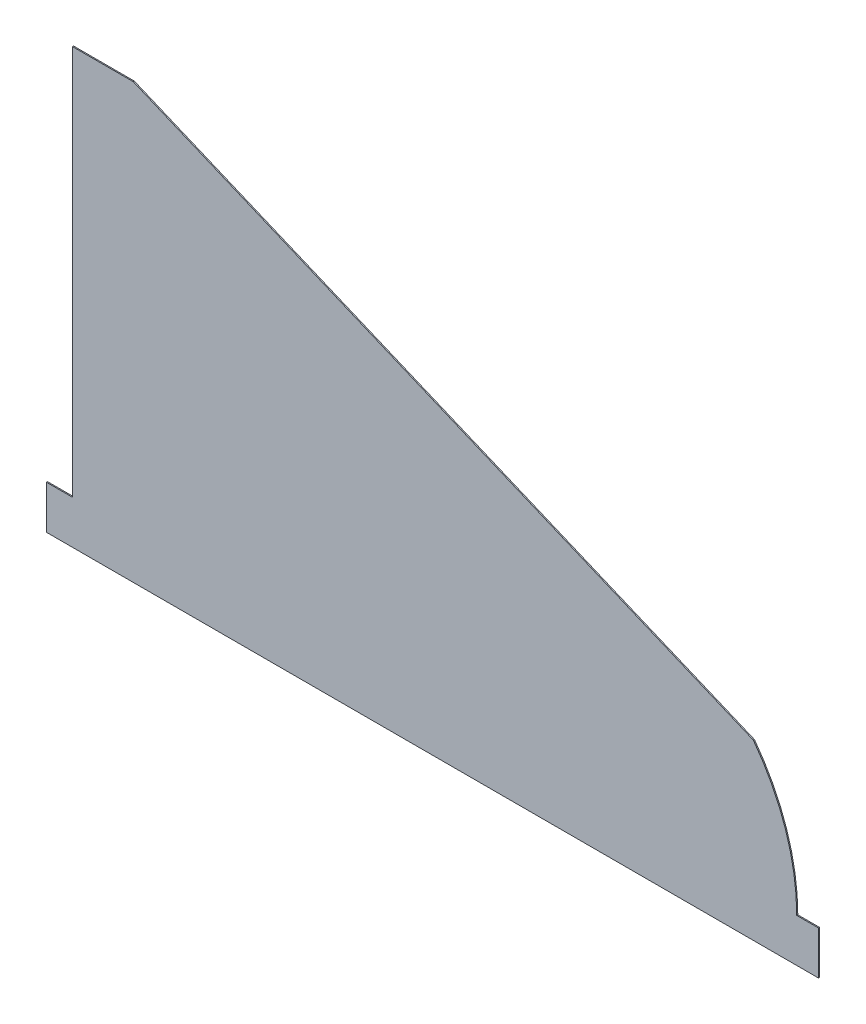
ISO-10303-21;
HEADER;
FILE_DESCRIPTION(('STEP AP214'),'2;1');
FILE_NAME('part.step','',(''),(''),'','','');
FILE_SCHEMA(('AUTOMOTIVE_DESIGN { 1 0 10303 214 1 1 1 1 }'));
ENDSEC;
DATA;
#1=APPLICATION_CONTEXT('core data for automotive mechanical design processes');
#2=APPLICATION_PROTOCOL_DEFINITION('international standard','automotive_design',2000,#1);
#3=PRODUCT_CONTEXT('',#1,'mechanical');
#4=PRODUCT('Part','Part','',(#3));
#5=PRODUCT_RELATED_PRODUCT_CATEGORY('part','',(#4));
#6=PRODUCT_DEFINITION_FORMATION('','',#4);
#7=PRODUCT_DEFINITION_CONTEXT('part definition',#1,'design');
#8=PRODUCT_DEFINITION('design','',#6,#7);
#9=PRODUCT_DEFINITION_SHAPE('','',#8);
#10=(LENGTH_UNIT() NAMED_UNIT(*) SI_UNIT(.MILLI.,.METRE.));
#11=(NAMED_UNIT(*) PLANE_ANGLE_UNIT() SI_UNIT($,.RADIAN.));
#12=(NAMED_UNIT(*) SI_UNIT($,.STERADIAN.) SOLID_ANGLE_UNIT());
#13=UNCERTAINTY_MEASURE_WITH_UNIT(LENGTH_MEASURE(1.E-05),#10,'distance_accuracy_value','');
#14=(GEOMETRIC_REPRESENTATION_CONTEXT(3) GLOBAL_UNCERTAINTY_ASSIGNED_CONTEXT((#13)) GLOBAL_UNIT_ASSIGNED_CONTEXT((#10,
#11,#12)) REPRESENTATION_CONTEXT('',''));
#15=CARTESIAN_POINT('',(0.,0.,0.));
#16=DIRECTION('',(0.,0.,1.));
#17=DIRECTION('',(1.,0.,0.));
#18=AXIS2_PLACEMENT_3D('',#15,#16,#17);
#19=CARTESIAN_POINT('',(168.,0.,0.125));
#20=DIRECTION('',(0.,1.,0.));
#21=DIRECTION('',(0.,0.,1.));
#22=AXIS2_PLACEMENT_3D('',#19,#20,#21);
#23=PLANE('',#22);
#24=DIRECTION('',(1.,0.,0.));
#25=VECTOR('',#24,1.);
#26=CARTESIAN_POINT('',(168.,0.,-0.125));
#27=LINE('',#26,#25);
#28=CARTESIAN_POINT('',(-5.,0.,-0.125));
#29=VERTEX_POINT('',#28);
#30=CARTESIAN_POINT('',(173.,0.,-0.125));
#31=VERTEX_POINT('',#30);
#32=EDGE_CURVE('E82',#29,#31,#27,.T.);
#33=ORIENTED_EDGE('',*,*,#32,.T.);
#34=DIRECTION('',(0.,0.,-1.));
#35=VECTOR('',#34,1.);
#36=CARTESIAN_POINT('',(173.,0.,0.125));
#37=LINE('',#36,#35);
#38=CARTESIAN_POINT('',(173.,0.,0.125));
#39=VERTEX_POINT('',#38);
#40=EDGE_CURVE('E11',#39,#31,#37,.T.);
#41=ORIENTED_EDGE('',*,*,#40,.F.);
#42=DIRECTION('',(1.,0.,0.));
#43=VECTOR('',#42,1.);
#44=CARTESIAN_POINT('',(-5.,0.,0.125));
#45=LINE('',#44,#43);
#46=CARTESIAN_POINT('',(-5.,0.,0.125));
#47=VERTEX_POINT('',#46);
#48=EDGE_CURVE('E88',#47,#39,#45,.T.);
#49=ORIENTED_EDGE('',*,*,#48,.F.);
#50=DIRECTION('',(0.,0.,-1.));
#51=VECTOR('',#50,1.);
#52=CARTESIAN_POINT('',(-5.,0.,0.125));
#53=LINE('',#52,#51);
#54=EDGE_CURVE('E136',#47,#29,#53,.T.);
#55=ORIENTED_EDGE('',*,*,#54,.T.);
#56=EDGE_LOOP('',(#33,#41,#49,#55));
#57=FACE_BOUND('',#56,.T.);
#58=ADVANCED_FACE('F32',(#57),#23,.F.);
#59=CARTESIAN_POINT('',(173.,0.,0.125));
#60=DIRECTION('',(-1.,0.,0.));
#61=DIRECTION('',(0.,0.,1.));
#62=AXIS2_PLACEMENT_3D('',#59,#60,#61);
#63=PLANE('',#62);
#64=DIRECTION('',(0.,1.,0.));
#65=VECTOR('',#64,1.);
#66=CARTESIAN_POINT('',(173.,0.,-0.125));
#67=LINE('',#66,#65);
#68=CARTESIAN_POINT('',(173.,10.,-0.125));
#69=VERTEX_POINT('',#68);
#70=EDGE_CURVE('E138',#31,#69,#67,.T.);
#71=ORIENTED_EDGE('',*,*,#70,.T.);
#72=DIRECTION('',(0.,0.,-1.));
#73=VECTOR('',#72,1.);
#74=CARTESIAN_POINT('',(173.,10.,0.125));
#75=LINE('',#74,#73);
#76=CARTESIAN_POINT('',(173.,10.,0.125));
#77=VERTEX_POINT('',#76);
#78=EDGE_CURVE('E39',#77,#69,#75,.T.);
#79=ORIENTED_EDGE('',*,*,#78,.F.);
#80=DIRECTION('',(0.,1.,0.));
#81=VECTOR('',#80,1.);
#82=CARTESIAN_POINT('',(173.,0.,0.125));
#83=LINE('',#82,#81);
#84=EDGE_CURVE('E171',#39,#77,#83,.T.);
#85=ORIENTED_EDGE('',*,*,#84,.F.);
#86=ORIENTED_EDGE('',*,*,#40,.T.);
#87=EDGE_LOOP('',(#71,#79,#85,#86));
#88=FACE_BOUND('',#87,.T.);
#89=ADVANCED_FACE('F196',(#88),#63,.F.);
#90=CARTESIAN_POINT('',(173.,10.,0.125));
#91=DIRECTION('',(0.,-1.,0.));
#92=DIRECTION('',(0.,0.,-1.));
#93=AXIS2_PLACEMENT_3D('',#90,#91,#92);
#94=PLANE('',#93);
#95=DIRECTION('',(-1.,0.,0.));
#96=VECTOR('',#95,1.);
#97=CARTESIAN_POINT('',(173.,10.,-0.125));
#98=LINE('',#97,#96);
#99=CARTESIAN_POINT('',(168.,10.,-0.125));
#100=VERTEX_POINT('',#99);
#101=EDGE_CURVE('E140',#69,#100,#98,.T.);
#102=ORIENTED_EDGE('',*,*,#101,.T.);
#103=DIRECTION('',(0.,0.,-1.));
#104=VECTOR('',#103,1.);
#105=CARTESIAN_POINT('',(168.,10.,0.125));
#106=LINE('',#105,#104);
#107=CARTESIAN_POINT('',(168.,10.,0.125));
#108=VERTEX_POINT('',#107);
#109=EDGE_CURVE('E155',#108,#100,#106,.T.);
#110=ORIENTED_EDGE('',*,*,#109,.F.);
#111=DIRECTION('',(-1.,0.,0.));
#112=VECTOR('',#111,1.);
#113=CARTESIAN_POINT('',(173.,10.,0.125));
#114=LINE('',#113,#112);
#115=EDGE_CURVE('E164',#77,#108,#114,.T.);
#116=ORIENTED_EDGE('',*,*,#115,.F.);
#117=ORIENTED_EDGE('',*,*,#78,.T.);
#118=EDGE_LOOP('',(#102,#110,#116,#117));
#119=FACE_BOUND('',#118,.T.);
#120=ADVANCED_FACE('F162',(#119),#94,.F.);
#121=CARTESIAN_POINT('',(118.,9.99999999999999,0.125));
#122=DIRECTION('',(0.,0.,-1.));
#123=DIRECTION('',(-1.,0.,0.));
#124=AXIS2_PLACEMENT_3D('',#121,#122,#123);
#125=CYLINDRICAL_SURFACE('',#124,50.);
#126=CARTESIAN_POINT('',(118.,9.99999999999999,-0.125));
#127=DIRECTION('',(0.,0.,1.));
#128=DIRECTION('',(1.,0.,0.));
#129=AXIS2_PLACEMENT_3D('',#126,#127,#128);
#130=CIRCLE('',#129,50.);
#131=CARTESIAN_POINT('',(158.,40.,-0.125));
#132=VERTEX_POINT('',#131);
#133=EDGE_CURVE('E142',#100,#132,#130,.T.);
#134=ORIENTED_EDGE('',*,*,#133,.T.);
#135=DIRECTION('',(0.,0.,-1.));
#136=VECTOR('',#135,1.);
#137=CARTESIAN_POINT('',(158.,40.,0.125));
#138=LINE('',#137,#136);
#139=CARTESIAN_POINT('',(158.,40.,0.125));
#140=VERTEX_POINT('',#139);
#141=EDGE_CURVE('E123',#140,#132,#138,.T.);
#142=ORIENTED_EDGE('',*,*,#141,.F.);
#143=CARTESIAN_POINT('',(118.,9.99999999999999,0.125));
#144=DIRECTION('',(0.,0.,1.));
#145=DIRECTION('',(1.,0.,0.));
#146=AXIS2_PLACEMENT_3D('',#143,#144,#145);
#147=CIRCLE('',#146,50.);
#148=EDGE_CURVE('E110',#108,#140,#147,.T.);
#149=ORIENTED_EDGE('',*,*,#148,.F.);
#150=ORIENTED_EDGE('',*,*,#109,.T.);
#151=EDGE_LOOP('',(#134,#142,#149,#150));
#152=FACE_BOUND('',#151,.T.);
#153=ADVANCED_FACE('F170',(#152),#125,.T.);
#154=CARTESIAN_POINT('',(158.,40.,0.125));
#155=DIRECTION('',(-0.386903571948418,-0.922120179810395,0.));
#156=DIRECTION('',(0.922120179810395,-0.386903571948418,0.));
#157=AXIS2_PLACEMENT_3D('',#154,#155,#156);
#158=PLANE('',#157);
#159=DIRECTION('',(-0.922120179810395,0.386903571948418,0.));
#160=VECTOR('',#159,1.);
#161=CARTESIAN_POINT('',(158.,40.,-0.125));
#162=LINE('',#161,#160);
#163=CARTESIAN_POINT('',(15.,100.,-0.125));
#164=VERTEX_POINT('',#163);
#165=EDGE_CURVE('E119',#132,#164,#162,.T.);
#166=ORIENTED_EDGE('',*,*,#165,.T.);
#167=DIRECTION('',(0.,0.,-1.));
#168=VECTOR('',#167,1.);
#169=CARTESIAN_POINT('',(15.,100.,0.125));
#170=LINE('',#169,#168);
#171=CARTESIAN_POINT('',(15.,100.,0.125));
#172=VERTEX_POINT('',#171);
#173=EDGE_CURVE('E116',#172,#164,#170,.T.);
#174=ORIENTED_EDGE('',*,*,#173,.F.);
#175=DIRECTION('',(-0.922120179810395,0.386903571948418,0.));
#176=VECTOR('',#175,1.);
#177=CARTESIAN_POINT('',(158.,40.,0.125));
#178=LINE('',#177,#176);
#179=EDGE_CURVE('E103',#140,#172,#178,.T.);
#180=ORIENTED_EDGE('',*,*,#179,.F.);
#181=ORIENTED_EDGE('',*,*,#141,.T.);
#182=EDGE_LOOP('',(#166,#174,#180,#181));
#183=FACE_BOUND('',#182,.T.);
#184=ADVANCED_FACE('F117',(#183),#158,.F.);
#185=CARTESIAN_POINT('',(15.,100.,0.125));
#186=DIRECTION('',(0.,-1.,0.));
#187=DIRECTION('',(0.,0.,-1.));
#188=AXIS2_PLACEMENT_3D('',#185,#186,#187);
#189=PLANE('',#188);
#190=DIRECTION('',(-1.,0.,0.));
#191=VECTOR('',#190,1.);
#192=CARTESIAN_POINT('',(15.,100.,-0.125));
#193=LINE('',#192,#191);
#194=CARTESIAN_POINT('',(1.00000000000002,100.,-0.125));
#195=VERTEX_POINT('',#194);
#196=EDGE_CURVE('E145',#164,#195,#193,.T.);
#197=ORIENTED_EDGE('',*,*,#196,.T.);
#198=DIRECTION('',(0.,0.,1.));
#199=VECTOR('',#198,1.);
#200=CARTESIAN_POINT('',(1.00000000000002,100.,-0.125));
#201=LINE('',#200,#199);
#202=CARTESIAN_POINT('',(1.00000000000002,100.,0.125));
#203=VERTEX_POINT('',#202);
#204=EDGE_CURVE('E129',#195,#203,#201,.T.);
#205=ORIENTED_EDGE('',*,*,#204,.T.);
#206=DIRECTION('',(-1.,0.,0.));
#207=VECTOR('',#206,1.);
#208=CARTESIAN_POINT('',(15.,100.,0.125));
#209=LINE('',#208,#207);
#210=EDGE_CURVE('E108',#172,#203,#209,.T.);
#211=ORIENTED_EDGE('',*,*,#210,.F.);
#212=ORIENTED_EDGE('',*,*,#173,.T.);
#213=EDGE_LOOP('',(#197,#205,#211,#212));
#214=FACE_BOUND('',#213,.T.);
#215=ADVANCED_FACE('F127',(#214),#189,.F.);
#216=CARTESIAN_POINT('',(0.,10.,0.125));
#217=DIRECTION('',(0.,-1.,0.));
#218=DIRECTION('',(0.,0.,-1.));
#219=AXIS2_PLACEMENT_3D('',#216,#217,#218);
#220=PLANE('',#219);
#221=DIRECTION('',(-1.,0.,0.));
#222=VECTOR('',#221,1.);
#223=CARTESIAN_POINT('',(0.,10.,-0.125));
#224=LINE('',#223,#222);
#225=CARTESIAN_POINT('',(1.00000000000001,10.,-0.125));
#226=VERTEX_POINT('',#225);
#227=CARTESIAN_POINT('',(-5.,10.,-0.125));
#228=VERTEX_POINT('',#227);
#229=EDGE_CURVE('E46',#226,#228,#224,.T.);
#230=ORIENTED_EDGE('',*,*,#229,.T.);
#231=DIRECTION('',(0.,0.,-1.));
#232=VECTOR('',#231,1.);
#233=CARTESIAN_POINT('',(-5.,10.,0.125));
#234=LINE('',#233,#232);
#235=CARTESIAN_POINT('',(-5.,10.,0.125));
#236=VERTEX_POINT('',#235);
#237=EDGE_CURVE('E124',#236,#228,#234,.T.);
#238=ORIENTED_EDGE('',*,*,#237,.F.);
#239=DIRECTION('',(-1.,0.,0.));
#240=VECTOR('',#239,1.);
#241=CARTESIAN_POINT('',(0.,10.,0.125));
#242=LINE('',#241,#240);
#243=CARTESIAN_POINT('',(1.00000000000002,10.,0.125));
#244=VERTEX_POINT('',#243);
#245=EDGE_CURVE('E130',#244,#236,#242,.T.);
#246=ORIENTED_EDGE('',*,*,#245,.F.);
#247=DIRECTION('',(0.,0.,1.));
#248=VECTOR('',#247,1.);
#249=CARTESIAN_POINT('',(1.00000000000002,10.,-0.125));
#250=LINE('',#249,#248);
#251=EDGE_CURVE('E176',#226,#244,#250,.T.);
#252=ORIENTED_EDGE('',*,*,#251,.F.);
#253=EDGE_LOOP('',(#230,#238,#246,#252));
#254=FACE_BOUND('',#253,.T.);
#255=ADVANCED_FACE('F191',(#254),#220,.F.);
#256=CARTESIAN_POINT('',(-5.,10.,0.125));
#257=DIRECTION('',(1.,0.,0.));
#258=DIRECTION('',(0.,1.,0.));
#259=AXIS2_PLACEMENT_3D('',#256,#257,#258);
#260=PLANE('',#259);
#261=DIRECTION('',(0.,-1.,0.));
#262=VECTOR('',#261,1.);
#263=CARTESIAN_POINT('',(-5.,10.,-0.125));
#264=LINE('',#263,#262);
#265=EDGE_CURVE('E148',#228,#29,#264,.T.);
#266=ORIENTED_EDGE('',*,*,#265,.T.);
#267=ORIENTED_EDGE('',*,*,#54,.F.);
#268=DIRECTION('',(0.,-1.,0.));
#269=VECTOR('',#268,1.);
#270=CARTESIAN_POINT('',(-5.,10.,0.125));
#271=LINE('',#270,#269);
#272=EDGE_CURVE('E55',#236,#47,#271,.T.);
#273=ORIENTED_EDGE('',*,*,#272,.F.);
#274=ORIENTED_EDGE('',*,*,#237,.T.);
#275=EDGE_LOOP('',(#266,#267,#273,#274));
#276=FACE_BOUND('',#275,.T.);
#277=ADVANCED_FACE('F194',(#276),#260,.F.);
#278=CARTESIAN_POINT('',(118.,9.99999999999999,0.125));
#279=DIRECTION('',(0.,0.,1.));
#280=DIRECTION('',(1.,0.,0.));
#281=AXIS2_PLACEMENT_3D('',#278,#279,#280);
#282=PLANE('',#281);
#283=DIRECTION('',(0.,1.,0.));
#284=VECTOR('',#283,1.);
#285=CARTESIAN_POINT('',(1.00000000000002,10.,0.125));
#286=LINE('',#285,#284);
#287=EDGE_CURVE('E181',#244,#203,#286,.T.);
#288=ORIENTED_EDGE('',*,*,#287,.F.);
#289=ORIENTED_EDGE('',*,*,#245,.T.);
#290=ORIENTED_EDGE('',*,*,#272,.T.);
#291=ORIENTED_EDGE('',*,*,#48,.T.);
#292=ORIENTED_EDGE('',*,*,#84,.T.);
#293=ORIENTED_EDGE('',*,*,#115,.T.);
#294=ORIENTED_EDGE('',*,*,#148,.T.);
#295=ORIENTED_EDGE('',*,*,#179,.T.);
#296=ORIENTED_EDGE('',*,*,#210,.T.);
#297=EDGE_LOOP('',(#288,#289,#290,#291,#292,#293,#294,#295,#296));
#298=FACE_BOUND('',#297,.T.);
#299=ADVANCED_FACE('F106',(#298),#282,.T.);
#300=CARTESIAN_POINT('',(118.,9.99999999999999,-0.125));
#301=DIRECTION('',(0.,0.,1.));
#302=DIRECTION('',(1.,0.,0.));
#303=AXIS2_PLACEMENT_3D('',#300,#301,#302);
#304=PLANE('',#303);
#305=ORIENTED_EDGE('',*,*,#229,.F.);
#306=DIRECTION('',(0.,1.,0.));
#307=VECTOR('',#306,1.);
#308=CARTESIAN_POINT('',(1.00000000000002,10.,-0.125));
#309=LINE('',#308,#307);
#310=EDGE_CURVE('E179',#226,#195,#309,.T.);
#311=ORIENTED_EDGE('',*,*,#310,.T.);
#312=ORIENTED_EDGE('',*,*,#196,.F.);
#313=ORIENTED_EDGE('',*,*,#165,.F.);
#314=ORIENTED_EDGE('',*,*,#133,.F.);
#315=ORIENTED_EDGE('',*,*,#101,.F.);
#316=ORIENTED_EDGE('',*,*,#70,.F.);
#317=ORIENTED_EDGE('',*,*,#32,.F.);
#318=ORIENTED_EDGE('',*,*,#265,.F.);
#319=EDGE_LOOP('',(#305,#311,#312,#313,#314,#315,#316,#317,#318));
#320=FACE_BOUND('',#319,.T.);
#321=ADVANCED_FACE('F168',(#320),#304,.F.);
#322=CARTESIAN_POINT('',(1.00000000000002,10.,-0.125));
#323=DIRECTION('',(1.,0.,0.));
#324=DIRECTION('',(0.,0.,-1.));
#325=AXIS2_PLACEMENT_3D('',#322,#323,#324);
#326=PLANE('',#325);
#327=ORIENTED_EDGE('',*,*,#287,.T.);
#328=ORIENTED_EDGE('',*,*,#204,.F.);
#329=ORIENTED_EDGE('',*,*,#310,.F.);
#330=ORIENTED_EDGE('',*,*,#251,.T.);
#331=EDGE_LOOP('',(#327,#328,#329,#330));
#332=FACE_BOUND('',#331,.T.);
#333=ADVANCED_FACE('F187',(#332),#326,.F.);
#334=CLOSED_SHELL('',(#58,#89,#120,#153,#184,#215,#255,#277,#299,#321,#333));
#335=MANIFOLD_SOLID_BREP('B2',#334);
#336=ADVANCED_BREP_SHAPE_REPRESENTATION('',(#18,#335),#14);
#337=SHAPE_DEFINITION_REPRESENTATION(#9,#336);
ENDSEC;
END-ISO-10303-21;
